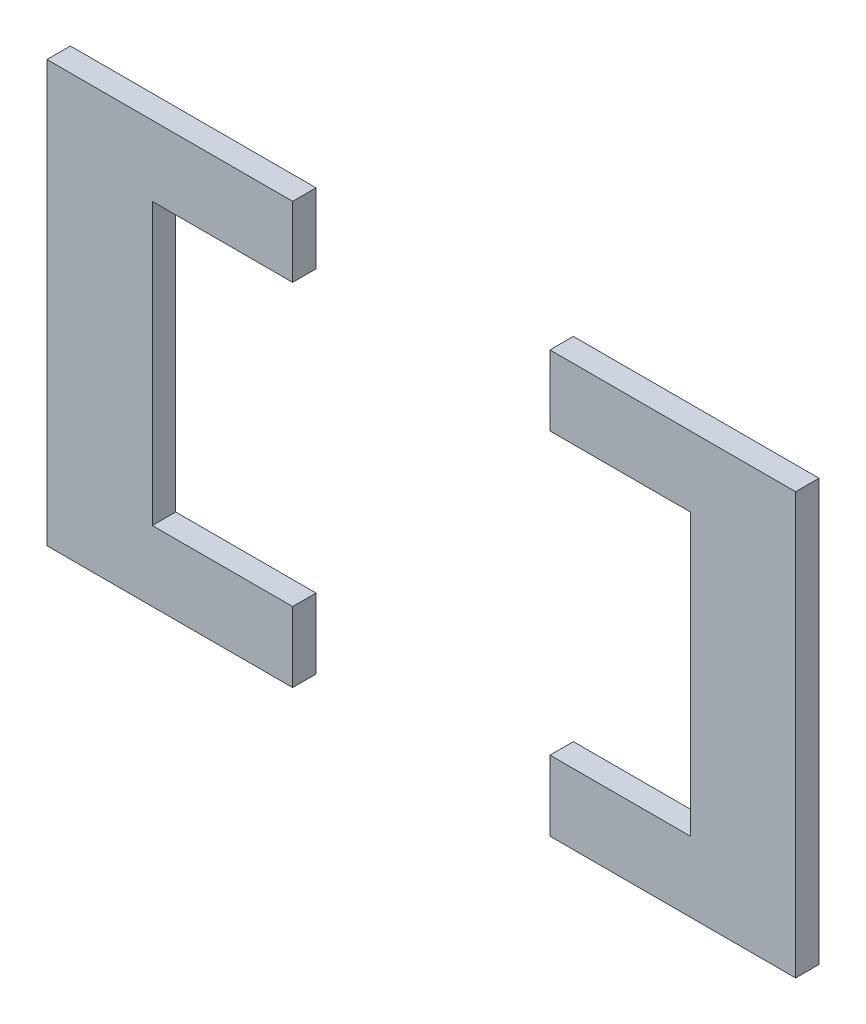
ISO-10303-21;
HEADER;
FILE_DESCRIPTION(('STEP AP214'),'2;1');
FILE_NAME('part.step','',(''),(''),'','','');
FILE_SCHEMA(('AUTOMOTIVE_DESIGN { 1 0 10303 214 1 1 1 1 }'));
ENDSEC;
DATA;
#1=APPLICATION_CONTEXT('core data for automotive mechanical design processes');
#2=APPLICATION_PROTOCOL_DEFINITION('international standard','automotive_design',2000,#1);
#3=PRODUCT_CONTEXT('',#1,'mechanical');
#4=PRODUCT('Part','Part','',(#3));
#5=PRODUCT_RELATED_PRODUCT_CATEGORY('part','',(#4));
#6=PRODUCT_DEFINITION_FORMATION('','',#4);
#7=PRODUCT_DEFINITION_CONTEXT('part definition',#1,'design');
#8=PRODUCT_DEFINITION('design','',#6,#7);
#9=PRODUCT_DEFINITION_SHAPE('','',#8);
#10=(LENGTH_UNIT() NAMED_UNIT(*) SI_UNIT(.MILLI.,.METRE.));
#11=(NAMED_UNIT(*) PLANE_ANGLE_UNIT() SI_UNIT($,.RADIAN.));
#12=(NAMED_UNIT(*) SI_UNIT($,.STERADIAN.) SOLID_ANGLE_UNIT());
#13=UNCERTAINTY_MEASURE_WITH_UNIT(LENGTH_MEASURE(1.E-05),#10,'distance_accuracy_value','');
#14=(GEOMETRIC_REPRESENTATION_CONTEXT(3) GLOBAL_UNCERTAINTY_ASSIGNED_CONTEXT((#13)) GLOBAL_UNIT_ASSIGNED_CONTEXT((#10,
#11,#12)) REPRESENTATION_CONTEXT('',''));
#15=CARTESIAN_POINT('',(0.,0.,0.));
#16=DIRECTION('',(0.,0.,1.));
#17=DIRECTION('',(1.,0.,0.));
#18=AXIS2_PLACEMENT_3D('',#15,#16,#17);
#19=CARTESIAN_POINT('',(-11.0000000000001,63.5,1.));
#20=DIRECTION('',(-1.,0.,0.));
#21=DIRECTION('',(0.,-1.,0.));
#22=AXIS2_PLACEMENT_3D('',#19,#20,#21);
#23=PLANE('',#22);
#24=DIRECTION('',(0.,1.,0.));
#25=VECTOR('',#24,1.);
#26=CARTESIAN_POINT('',(-11.0000000000001,63.5,0.));
#27=LINE('',#26,#25);
#28=CARTESIAN_POINT('',(-11.0000000000001,63.5,0.));
#29=VERTEX_POINT('',#28);
#30=CARTESIAN_POINT('',(-11.0000000000001,66.5,0.));
#31=VERTEX_POINT('',#30);
#32=EDGE_CURVE('E12',#29,#31,#27,.T.);
#33=ORIENTED_EDGE('',*,*,#32,.T.);
#34=DIRECTION('',(0.,0.,-1.));
#35=VECTOR('',#34,1.);
#36=CARTESIAN_POINT('',(-11.0000000000001,66.5,1.));
#37=LINE('',#36,#35);
#38=CARTESIAN_POINT('',(-11.0000000000001,66.5,1.));
#39=VERTEX_POINT('',#38);
#40=EDGE_CURVE('E191',#39,#31,#37,.T.);
#41=ORIENTED_EDGE('',*,*,#40,.F.);
#42=DIRECTION('',(0.,1.,0.));
#43=VECTOR('',#42,1.);
#44=CARTESIAN_POINT('',(-11.0000000000001,63.5,1.));
#45=LINE('',#44,#43);
#46=CARTESIAN_POINT('',(-11.0000000000001,63.5,1.));
#47=VERTEX_POINT('',#46);
#48=EDGE_CURVE('E59',#47,#39,#45,.T.);
#49=ORIENTED_EDGE('',*,*,#48,.F.);
#50=DIRECTION('',(0.,0.,-1.));
#51=VECTOR('',#50,1.);
#52=CARTESIAN_POINT('',(-11.0000000000001,63.5,1.));
#53=LINE('',#52,#51);
#54=EDGE_CURVE('E159',#47,#29,#53,.T.);
#55=ORIENTED_EDGE('',*,*,#54,.T.);
#56=EDGE_LOOP('',(#33,#41,#49,#55));
#57=FACE_BOUND('',#56,.T.);
#58=ADVANCED_FACE('F55',(#57),#23,.F.);
#59=CARTESIAN_POINT('',(-11.0000000000001,66.5,1.));
#60=DIRECTION('',(0.,-1.,0.));
#61=DIRECTION('',(0.,0.,-1.));
#62=AXIS2_PLACEMENT_3D('',#59,#60,#61);
#63=PLANE('',#62);
#64=DIRECTION('',(-1.,0.,0.));
#65=VECTOR('',#64,1.);
#66=CARTESIAN_POINT('',(-11.0000000000001,66.5,0.));
#67=LINE('',#66,#65);
#68=CARTESIAN_POINT('',(-21.5,66.5,0.));
#69=VERTEX_POINT('',#68);
#70=EDGE_CURVE('E65',#31,#69,#67,.T.);
#71=ORIENTED_EDGE('',*,*,#70,.T.);
#72=DIRECTION('',(0.,0.,-1.));
#73=VECTOR('',#72,1.);
#74=CARTESIAN_POINT('',(-21.5,66.5,1.));
#75=LINE('',#74,#73);
#76=CARTESIAN_POINT('',(-21.5,66.5,1.));
#77=VERTEX_POINT('',#76);
#78=EDGE_CURVE('E135',#77,#69,#75,.T.);
#79=ORIENTED_EDGE('',*,*,#78,.F.);
#80=DIRECTION('',(-1.,0.,0.));
#81=VECTOR('',#80,1.);
#82=CARTESIAN_POINT('',(-11.0000000000001,66.5,1.));
#83=LINE('',#82,#81);
#84=EDGE_CURVE('E101',#39,#77,#83,.T.);
#85=ORIENTED_EDGE('',*,*,#84,.F.);
#86=ORIENTED_EDGE('',*,*,#40,.T.);
#87=EDGE_LOOP('',(#71,#79,#85,#86));
#88=FACE_BOUND('',#87,.T.);
#89=ADVANCED_FACE('F197',(#88),#63,.F.);
#90=CARTESIAN_POINT('',(-21.5,66.5,1.));
#91=DIRECTION('',(1.,0.,0.));
#92=DIRECTION('',(0.,1.,0.));
#93=AXIS2_PLACEMENT_3D('',#90,#91,#92);
#94=PLANE('',#93);
#95=DIRECTION('',(0.,-1.,0.));
#96=VECTOR('',#95,1.);
#97=CARTESIAN_POINT('',(-21.5,66.5,0.));
#98=LINE('',#97,#96);
#99=CARTESIAN_POINT('',(-21.5,48.5,0.));
#100=VERTEX_POINT('',#99);
#101=EDGE_CURVE('E129',#69,#100,#98,.T.);
#102=ORIENTED_EDGE('',*,*,#101,.T.);
#103=DIRECTION('',(0.,0.,-1.));
#104=VECTOR('',#103,1.);
#105=CARTESIAN_POINT('',(-21.5,48.5,1.));
#106=LINE('',#105,#104);
#107=CARTESIAN_POINT('',(-21.5,48.5,1.));
#108=VERTEX_POINT('',#107);
#109=EDGE_CURVE('E133',#108,#100,#106,.T.);
#110=ORIENTED_EDGE('',*,*,#109,.F.);
#111=DIRECTION('',(0.,-1.,0.));
#112=VECTOR('',#111,1.);
#113=CARTESIAN_POINT('',(-21.5,66.5,1.));
#114=LINE('',#113,#112);
#115=EDGE_CURVE('E166',#77,#108,#114,.T.);
#116=ORIENTED_EDGE('',*,*,#115,.F.);
#117=ORIENTED_EDGE('',*,*,#78,.T.);
#118=EDGE_LOOP('',(#102,#110,#116,#117));
#119=FACE_BOUND('',#118,.T.);
#120=ADVANCED_FACE('F131',(#119),#94,.F.);
#121=CARTESIAN_POINT('',(-21.5,48.5,1.));
#122=DIRECTION('',(0.,1.,0.));
#123=DIRECTION('',(-1.,0.,0.));
#124=AXIS2_PLACEMENT_3D('',#121,#122,#123);
#125=PLANE('',#124);
#126=DIRECTION('',(1.,0.,0.));
#127=VECTOR('',#126,1.);
#128=CARTESIAN_POINT('',(-21.5,48.5,0.));
#129=LINE('',#128,#127);
#130=CARTESIAN_POINT('',(-11.0000000000001,48.5,0.));
#131=VERTEX_POINT('',#130);
#132=EDGE_CURVE('E137',#100,#131,#129,.T.);
#133=ORIENTED_EDGE('',*,*,#132,.T.);
#134=DIRECTION('',(0.,0.,-1.));
#135=VECTOR('',#134,1.);
#136=CARTESIAN_POINT('',(-11.0000000000001,48.5,1.));
#137=LINE('',#136,#135);
#138=CARTESIAN_POINT('',(-11.0000000000001,48.5,1.));
#139=VERTEX_POINT('',#138);
#140=EDGE_CURVE('E144',#139,#131,#137,.T.);
#141=ORIENTED_EDGE('',*,*,#140,.F.);
#142=DIRECTION('',(1.,0.,0.));
#143=VECTOR('',#142,1.);
#144=CARTESIAN_POINT('',(-21.5,48.5,1.));
#145=LINE('',#144,#143);
#146=EDGE_CURVE('E143',#108,#139,#145,.T.);
#147=ORIENTED_EDGE('',*,*,#146,.F.);
#148=ORIENTED_EDGE('',*,*,#109,.T.);
#149=EDGE_LOOP('',(#133,#141,#147,#148));
#150=FACE_BOUND('',#149,.T.);
#151=ADVANCED_FACE('F140',(#150),#125,.F.);
#152=CARTESIAN_POINT('',(-11.0000000000001,48.5,1.));
#153=DIRECTION('',(-1.,0.,0.));
#154=DIRECTION('',(0.,-1.,0.));
#155=AXIS2_PLACEMENT_3D('',#152,#153,#154);
#156=PLANE('',#155);
#157=DIRECTION('',(0.,1.,0.));
#158=VECTOR('',#157,1.);
#159=CARTESIAN_POINT('',(-11.0000000000001,48.5,0.));
#160=LINE('',#159,#158);
#161=CARTESIAN_POINT('',(-11.0000000000001,51.5,0.));
#162=VERTEX_POINT('',#161);
#163=EDGE_CURVE('E149',#131,#162,#160,.T.);
#164=ORIENTED_EDGE('',*,*,#163,.T.);
#165=DIRECTION('',(0.,0.,-1.));
#166=VECTOR('',#165,1.);
#167=CARTESIAN_POINT('',(-11.0000000000001,51.5,1.));
#168=LINE('',#167,#166);
#169=CARTESIAN_POINT('',(-11.0000000000001,51.5,1.));
#170=VERTEX_POINT('',#169);
#171=EDGE_CURVE('E183',#170,#162,#168,.T.);
#172=ORIENTED_EDGE('',*,*,#171,.F.);
#173=DIRECTION('',(0.,1.,0.));
#174=VECTOR('',#173,1.);
#175=CARTESIAN_POINT('',(-11.0000000000001,48.5,1.));
#176=LINE('',#175,#174);
#177=EDGE_CURVE('E163',#139,#170,#176,.T.);
#178=ORIENTED_EDGE('',*,*,#177,.F.);
#179=ORIENTED_EDGE('',*,*,#140,.T.);
#180=EDGE_LOOP('',(#164,#172,#178,#179));
#181=FACE_BOUND('',#180,.T.);
#182=ADVANCED_FACE('F200',(#181),#156,.F.);
#183=CARTESIAN_POINT('',(-11.0000000000001,51.5,1.));
#184=DIRECTION('',(0.,-1.,0.));
#185=DIRECTION('',(1.,0.,0.));
#186=AXIS2_PLACEMENT_3D('',#183,#184,#185);
#187=PLANE('',#186);
#188=DIRECTION('',(-1.,0.,0.));
#189=VECTOR('',#188,1.);
#190=CARTESIAN_POINT('',(-11.0000000000001,51.5,0.));
#191=LINE('',#190,#189);
#192=CARTESIAN_POINT('',(-17.,51.5,0.));
#193=VERTEX_POINT('',#192);
#194=EDGE_CURVE('E151',#162,#193,#191,.T.);
#195=ORIENTED_EDGE('',*,*,#194,.T.);
#196=DIRECTION('',(0.,0.,-1.));
#197=VECTOR('',#196,1.);
#198=CARTESIAN_POINT('',(-17.,51.5,1.));
#199=LINE('',#198,#197);
#200=CARTESIAN_POINT('',(-17.,51.5,1.));
#201=VERTEX_POINT('',#200);
#202=EDGE_CURVE('E180',#201,#193,#199,.T.);
#203=ORIENTED_EDGE('',*,*,#202,.F.);
#204=DIRECTION('',(-1.,0.,0.));
#205=VECTOR('',#204,1.);
#206=CARTESIAN_POINT('',(-11.0000000000001,51.5,1.));
#207=LINE('',#206,#205);
#208=EDGE_CURVE('E161',#170,#201,#207,.T.);
#209=ORIENTED_EDGE('',*,*,#208,.F.);
#210=ORIENTED_EDGE('',*,*,#171,.T.);
#211=EDGE_LOOP('',(#195,#203,#209,#210));
#212=FACE_BOUND('',#211,.T.);
#213=ADVANCED_FACE('F178',(#212),#187,.F.);
#214=CARTESIAN_POINT('',(-17.,51.5,1.));
#215=DIRECTION('',(-1.,0.,0.));
#216=DIRECTION('',(0.,0.,1.));
#217=AXIS2_PLACEMENT_3D('',#214,#215,#216);
#218=PLANE('',#217);
#219=DIRECTION('',(0.,1.,0.));
#220=VECTOR('',#219,1.);
#221=CARTESIAN_POINT('',(-17.,51.5,0.));
#222=LINE('',#221,#220);
#223=CARTESIAN_POINT('',(-17.,63.5,0.));
#224=VERTEX_POINT('',#223);
#225=EDGE_CURVE('E169',#193,#224,#222,.T.);
#226=ORIENTED_EDGE('',*,*,#225,.T.);
#227=DIRECTION('',(0.,0.,-1.));
#228=VECTOR('',#227,1.);
#229=CARTESIAN_POINT('',(-17.,63.5,1.));
#230=LINE('',#229,#228);
#231=CARTESIAN_POINT('',(-17.,63.5,1.));
#232=VERTEX_POINT('',#231);
#233=EDGE_CURVE('E188',#232,#224,#230,.T.);
#234=ORIENTED_EDGE('',*,*,#233,.F.);
#235=DIRECTION('',(0.,1.,0.));
#236=VECTOR('',#235,1.);
#237=CARTESIAN_POINT('',(-17.,51.5,1.));
#238=LINE('',#237,#236);
#239=EDGE_CURVE('E158',#201,#232,#238,.T.);
#240=ORIENTED_EDGE('',*,*,#239,.F.);
#241=ORIENTED_EDGE('',*,*,#202,.T.);
#242=EDGE_LOOP('',(#226,#234,#240,#241));
#243=FACE_BOUND('',#242,.T.);
#244=ADVANCED_FACE('F186',(#243),#218,.F.);
#245=CARTESIAN_POINT('',(-17.,63.5,1.));
#246=DIRECTION('',(0.,1.,0.));
#247=DIRECTION('',(0.,0.,1.));
#248=AXIS2_PLACEMENT_3D('',#245,#246,#247);
#249=PLANE('',#248);
#250=DIRECTION('',(1.,0.,0.));
#251=VECTOR('',#250,1.);
#252=CARTESIAN_POINT('',(-17.,63.5,0.));
#253=LINE('',#252,#251);
#254=EDGE_CURVE('E112',#224,#29,#253,.T.);
#255=ORIENTED_EDGE('',*,*,#254,.T.);
#256=ORIENTED_EDGE('',*,*,#54,.F.);
#257=DIRECTION('',(1.,0.,0.));
#258=VECTOR('',#257,1.);
#259=CARTESIAN_POINT('',(-17.,63.5,1.));
#260=LINE('',#259,#258);
#261=EDGE_CURVE('E156',#232,#47,#260,.T.);
#262=ORIENTED_EDGE('',*,*,#261,.F.);
#263=ORIENTED_EDGE('',*,*,#233,.T.);
#264=EDGE_LOOP('',(#255,#256,#262,#263));
#265=FACE_BOUND('',#264,.T.);
#266=ADVANCED_FACE('F201',(#265),#249,.F.);
#267=CARTESIAN_POINT('',(0.,0.,1.));
#268=DIRECTION('',(0.,0.,1.));
#269=DIRECTION('',(1.,0.,0.));
#270=AXIS2_PLACEMENT_3D('',#267,#268,#269);
#271=PLANE('',#270);
#272=ORIENTED_EDGE('',*,*,#48,.T.);
#273=ORIENTED_EDGE('',*,*,#84,.T.);
#274=ORIENTED_EDGE('',*,*,#115,.T.);
#275=ORIENTED_EDGE('',*,*,#146,.T.);
#276=ORIENTED_EDGE('',*,*,#177,.T.);
#277=ORIENTED_EDGE('',*,*,#208,.T.);
#278=ORIENTED_EDGE('',*,*,#239,.T.);
#279=ORIENTED_EDGE('',*,*,#261,.T.);
#280=EDGE_LOOP('',(#272,#273,#274,#275,#276,#277,#278,#279));
#281=FACE_BOUND('',#280,.T.);
#282=ADVANCED_FACE('F57',(#281),#271,.T.);
#283=CARTESIAN_POINT('',(0.,0.,0.));
#284=DIRECTION('',(0.,0.,1.));
#285=DIRECTION('',(1.,0.,0.));
#286=AXIS2_PLACEMENT_3D('',#283,#284,#285);
#287=PLANE('',#286);
#288=ORIENTED_EDGE('',*,*,#32,.F.);
#289=ORIENTED_EDGE('',*,*,#254,.F.);
#290=ORIENTED_EDGE('',*,*,#225,.F.);
#291=ORIENTED_EDGE('',*,*,#194,.F.);
#292=ORIENTED_EDGE('',*,*,#163,.F.);
#293=ORIENTED_EDGE('',*,*,#132,.F.);
#294=ORIENTED_EDGE('',*,*,#101,.F.);
#295=ORIENTED_EDGE('',*,*,#70,.F.);
#296=EDGE_LOOP('',(#288,#289,#290,#291,#292,#293,#294,#295));
#297=FACE_BOUND('',#296,.T.);
#298=ADVANCED_FACE('F147',(#297),#287,.F.);
#299=CLOSED_SHELL('',(#58,#89,#120,#151,#182,#213,#244,#266,#282,#298));
#300=MANIFOLD_SOLID_BREP('B2',#299);
#301=CARTESIAN_POINT('',(0.,63.5,1.));
#302=DIRECTION('',(1.,0.,0.));
#303=DIRECTION('',(0.,0.,-1.));
#304=AXIS2_PLACEMENT_3D('',#301,#302,#303);
#305=PLANE('',#304);
#306=DIRECTION('',(0.,-1.,0.));
#307=VECTOR('',#306,1.);
#308=CARTESIAN_POINT('',(0.,63.5,0.));
#309=LINE('',#308,#307);
#310=CARTESIAN_POINT('',(0.,66.5,0.));
#311=VERTEX_POINT('',#310);
#312=CARTESIAN_POINT('',(0.,63.5,0.));
#313=VERTEX_POINT('',#312);
#314=EDGE_CURVE('E424',#311,#313,#309,.T.);
#315=ORIENTED_EDGE('',*,*,#314,.T.);
#316=DIRECTION('',(0.,0.,-1.));
#317=VECTOR('',#316,1.);
#318=CARTESIAN_POINT('',(0.,63.5,1.));
#319=LINE('',#318,#317);
#320=CARTESIAN_POINT('',(0.,63.5,1.));
#321=VERTEX_POINT('',#320);
#322=EDGE_CURVE('E53',#321,#313,#319,.T.);
#323=ORIENTED_EDGE('',*,*,#322,.F.);
#324=DIRECTION('',(0.,-1.,0.));
#325=VECTOR('',#324,1.);
#326=CARTESIAN_POINT('',(0.,63.5,1.));
#327=LINE('',#326,#325);
#328=CARTESIAN_POINT('',(0.,66.5,1.));
#329=VERTEX_POINT('',#328);
#330=EDGE_CURVE('E446',#329,#321,#327,.T.);
#331=ORIENTED_EDGE('',*,*,#330,.F.);
#332=DIRECTION('',(0.,0.,-1.));
#333=VECTOR('',#332,1.);
#334=CARTESIAN_POINT('',(0.,66.5,1.));
#335=LINE('',#334,#333);
#336=EDGE_CURVE('E420',#329,#311,#335,.T.);
#337=ORIENTED_EDGE('',*,*,#336,.T.);
#338=EDGE_LOOP('',(#315,#323,#331,#337));
#339=FACE_BOUND('',#338,.T.);
#340=ADVANCED_FACE('F323',(#339),#305,.F.);
#341=CARTESIAN_POINT('',(5.99999999999996,63.5,1.));
#342=DIRECTION('',(0.,1.,0.));
#343=DIRECTION('',(0.,0.,1.));
#344=AXIS2_PLACEMENT_3D('',#341,#342,#343);
#345=PLANE('',#344);
#346=DIRECTION('',(1.,0.,0.));
#347=VECTOR('',#346,1.);
#348=CARTESIAN_POINT('',(5.99999999999996,63.5,0.));
#349=LINE('',#348,#347);
#350=CARTESIAN_POINT('',(5.99999999999996,63.5,0.));
#351=VERTEX_POINT('',#350);
#352=EDGE_CURVE('E428',#313,#351,#349,.T.);
#353=ORIENTED_EDGE('',*,*,#352,.T.);
#354=DIRECTION('',(0.,0.,-1.));
#355=VECTOR('',#354,1.);
#356=CARTESIAN_POINT('',(5.99999999999996,63.5,1.));
#357=LINE('',#356,#355);
#358=CARTESIAN_POINT('',(5.99999999999996,63.5,1.));
#359=VERTEX_POINT('',#358);
#360=EDGE_CURVE('E332',#359,#351,#357,.T.);
#361=ORIENTED_EDGE('',*,*,#360,.F.);
#362=DIRECTION('',(1.,0.,0.));
#363=VECTOR('',#362,1.);
#364=CARTESIAN_POINT('',(5.99999999999996,63.5,1.));
#365=LINE('',#364,#363);
#366=EDGE_CURVE('E383',#321,#359,#365,.T.);
#367=ORIENTED_EDGE('',*,*,#366,.F.);
#368=ORIENTED_EDGE('',*,*,#322,.T.);
#369=EDGE_LOOP('',(#353,#361,#367,#368));
#370=FACE_BOUND('',#369,.T.);
#371=ADVANCED_FACE('F492',(#370),#345,.F.);
#372=CARTESIAN_POINT('',(5.99999999999996,51.5,1.));
#373=DIRECTION('',(1.,0.,0.));
#374=DIRECTION('',(0.,1.,0.));
#375=AXIS2_PLACEMENT_3D('',#372,#373,#374);
#376=PLANE('',#375);
#377=DIRECTION('',(0.,-1.,0.));
#378=VECTOR('',#377,1.);
#379=CARTESIAN_POINT('',(5.99999999999996,51.5,0.));
#380=LINE('',#379,#378);
#381=CARTESIAN_POINT('',(5.99999999999996,51.5,0.));
#382=VERTEX_POINT('',#381);
#383=EDGE_CURVE('E431',#351,#382,#380,.T.);
#384=ORIENTED_EDGE('',*,*,#383,.T.);
#385=DIRECTION('',(0.,0.,-1.));
#386=VECTOR('',#385,1.);
#387=CARTESIAN_POINT('',(5.99999999999996,51.5,1.));
#388=LINE('',#387,#386);
#389=CARTESIAN_POINT('',(5.99999999999996,51.5,1.));
#390=VERTEX_POINT('',#389);
#391=EDGE_CURVE('E457',#390,#382,#388,.T.);
#392=ORIENTED_EDGE('',*,*,#391,.F.);
#393=DIRECTION('',(0.,-1.,0.));
#394=VECTOR('',#393,1.);
#395=CARTESIAN_POINT('',(5.99999999999996,51.5,1.));
#396=LINE('',#395,#394);
#397=EDGE_CURVE('E467',#359,#390,#396,.T.);
#398=ORIENTED_EDGE('',*,*,#397,.F.);
#399=ORIENTED_EDGE('',*,*,#360,.T.);
#400=EDGE_LOOP('',(#384,#392,#398,#399));
#401=FACE_BOUND('',#400,.T.);
#402=ADVANCED_FACE('F465',(#401),#376,.F.);
#403=CARTESIAN_POINT('',(0.,51.5,1.));
#404=DIRECTION('',(0.,-1.,0.));
#405=DIRECTION('',(0.,0.,-1.));
#406=AXIS2_PLACEMENT_3D('',#403,#404,#405);
#407=PLANE('',#406);
#408=DIRECTION('',(-1.,0.,0.));
#409=VECTOR('',#408,1.);
#410=CARTESIAN_POINT('',(0.,51.5,0.));
#411=LINE('',#410,#409);
#412=CARTESIAN_POINT('',(0.,51.5,0.));
#413=VERTEX_POINT('',#412);
#414=EDGE_CURVE('E434',#382,#413,#411,.T.);
#415=ORIENTED_EDGE('',*,*,#414,.T.);
#416=DIRECTION('',(0.,0.,-1.));
#417=VECTOR('',#416,1.);
#418=CARTESIAN_POINT('',(0.,51.5,1.));
#419=LINE('',#418,#417);
#420=CARTESIAN_POINT('',(0.,51.5,1.));
#421=VERTEX_POINT('',#420);
#422=EDGE_CURVE('E453',#421,#413,#419,.T.);
#423=ORIENTED_EDGE('',*,*,#422,.F.);
#424=DIRECTION('',(-1.,0.,0.));
#425=VECTOR('',#424,1.);
#426=CARTESIAN_POINT('',(0.,51.5,1.));
#427=LINE('',#426,#425);
#428=EDGE_CURVE('E480',#390,#421,#427,.T.);
#429=ORIENTED_EDGE('',*,*,#428,.F.);
#430=ORIENTED_EDGE('',*,*,#391,.T.);
#431=EDGE_LOOP('',(#415,#423,#429,#430));
#432=FACE_BOUND('',#431,.T.);
#433=ADVANCED_FACE('F475',(#432),#407,.F.);
#434=CARTESIAN_POINT('',(0.,48.5,1.));
#435=DIRECTION('',(1.,0.,0.));
#436=DIRECTION('',(0.,0.,-1.));
#437=AXIS2_PLACEMENT_3D('',#434,#435,#436);
#438=PLANE('',#437);
#439=DIRECTION('',(0.,-1.,0.));
#440=VECTOR('',#439,1.);
#441=CARTESIAN_POINT('',(0.,48.5,0.));
#442=LINE('',#441,#440);
#443=CARTESIAN_POINT('',(0.,48.5,0.));
#444=VERTEX_POINT('',#443);
#445=EDGE_CURVE('E437',#413,#444,#442,.T.);
#446=ORIENTED_EDGE('',*,*,#445,.T.);
#447=DIRECTION('',(0.,0.,-1.));
#448=VECTOR('',#447,1.);
#449=CARTESIAN_POINT('',(0.,48.5,1.));
#450=LINE('',#449,#448);
#451=CARTESIAN_POINT('',(0.,48.5,1.));
#452=VERTEX_POINT('',#451);
#453=EDGE_CURVE('E413',#452,#444,#450,.T.);
#454=ORIENTED_EDGE('',*,*,#453,.F.);
#455=DIRECTION('',(0.,-1.,0.));
#456=VECTOR('',#455,1.);
#457=CARTESIAN_POINT('',(0.,48.5,1.));
#458=LINE('',#457,#456);
#459=EDGE_CURVE('E402',#421,#452,#458,.T.);
#460=ORIENTED_EDGE('',*,*,#459,.F.);
#461=ORIENTED_EDGE('',*,*,#422,.T.);
#462=EDGE_LOOP('',(#446,#454,#460,#461));
#463=FACE_BOUND('',#462,.T.);
#464=ADVANCED_FACE('F478',(#463),#438,.F.);
#465=CARTESIAN_POINT('',(10.5,48.5,1.));
#466=DIRECTION('',(0.,1.,0.));
#467=DIRECTION('',(0.,0.,1.));
#468=AXIS2_PLACEMENT_3D('',#465,#466,#467);
#469=PLANE('',#468);
#470=DIRECTION('',(1.,0.,0.));
#471=VECTOR('',#470,1.);
#472=CARTESIAN_POINT('',(10.5,48.5,0.));
#473=LINE('',#472,#471);
#474=CARTESIAN_POINT('',(10.5,48.5,0.));
#475=VERTEX_POINT('',#474);
#476=EDGE_CURVE('E411',#444,#475,#473,.T.);
#477=ORIENTED_EDGE('',*,*,#476,.T.);
#478=DIRECTION('',(0.,0.,-1.));
#479=VECTOR('',#478,1.);
#480=CARTESIAN_POINT('',(10.5,48.5,1.));
#481=LINE('',#480,#479);
#482=CARTESIAN_POINT('',(10.5,48.5,1.));
#483=VERTEX_POINT('',#482);
#484=EDGE_CURVE('E408',#483,#475,#481,.T.);
#485=ORIENTED_EDGE('',*,*,#484,.F.);
#486=DIRECTION('',(1.,0.,0.));
#487=VECTOR('',#486,1.);
#488=CARTESIAN_POINT('',(10.5,48.5,1.));
#489=LINE('',#488,#487);
#490=EDGE_CURVE('E396',#452,#483,#489,.T.);
#491=ORIENTED_EDGE('',*,*,#490,.F.);
#492=ORIENTED_EDGE('',*,*,#453,.T.);
#493=EDGE_LOOP('',(#477,#485,#491,#492));
#494=FACE_BOUND('',#493,.T.);
#495=ADVANCED_FACE('F409',(#494),#469,.F.);
#496=CARTESIAN_POINT('',(10.5,66.5,1.));
#497=DIRECTION('',(-1.,0.,0.));
#498=DIRECTION('',(0.,-1.,0.));
#499=AXIS2_PLACEMENT_3D('',#496,#497,#498);
#500=PLANE('',#499);
#501=DIRECTION('',(0.,1.,0.));
#502=VECTOR('',#501,1.);
#503=CARTESIAN_POINT('',(10.5,66.5,0.));
#504=LINE('',#503,#502);
#505=CARTESIAN_POINT('',(10.5,66.5,0.));
#506=VERTEX_POINT('',#505);
#507=EDGE_CURVE('E369',#475,#506,#504,.T.);
#508=ORIENTED_EDGE('',*,*,#507,.T.);
#509=DIRECTION('',(0.,0.,-1.));
#510=VECTOR('',#509,1.);
#511=CARTESIAN_POINT('',(10.5,66.5,1.));
#512=LINE('',#511,#510);
#513=CARTESIAN_POINT('',(10.5,66.5,1.));
#514=VERTEX_POINT('',#513);
#515=EDGE_CURVE('E414',#514,#506,#512,.T.);
#516=ORIENTED_EDGE('',*,*,#515,.F.);
#517=DIRECTION('',(0.,1.,0.));
#518=VECTOR('',#517,1.);
#519=CARTESIAN_POINT('',(10.5,66.5,1.));
#520=LINE('',#519,#518);
#521=EDGE_CURVE('E400',#483,#514,#520,.T.);
#522=ORIENTED_EDGE('',*,*,#521,.F.);
#523=ORIENTED_EDGE('',*,*,#484,.T.);
#524=EDGE_LOOP('',(#508,#516,#522,#523));
#525=FACE_BOUND('',#524,.T.);
#526=ADVANCED_FACE('F416',(#525),#500,.F.);
#527=CARTESIAN_POINT('',(0.,66.5,1.));
#528=DIRECTION('',(0.,-1.,0.));
#529=DIRECTION('',(0.,0.,-1.));
#530=AXIS2_PLACEMENT_3D('',#527,#528,#529);
#531=PLANE('',#530);
#532=DIRECTION('',(-1.,0.,0.));
#533=VECTOR('',#532,1.);
#534=CARTESIAN_POINT('',(0.,66.5,0.));
#535=LINE('',#534,#533);
#536=EDGE_CURVE('E375',#506,#311,#535,.T.);
#537=ORIENTED_EDGE('',*,*,#536,.T.);
#538=ORIENTED_EDGE('',*,*,#336,.F.);
#539=DIRECTION('',(-1.,0.,0.));
#540=VECTOR('',#539,1.);
#541=CARTESIAN_POINT('',(0.,66.5,1.));
#542=LINE('',#541,#540);
#543=EDGE_CURVE('E340',#514,#329,#542,.T.);
#544=ORIENTED_EDGE('',*,*,#543,.F.);
#545=ORIENTED_EDGE('',*,*,#515,.T.);
#546=EDGE_LOOP('',(#537,#538,#544,#545));
#547=FACE_BOUND('',#546,.T.);
#548=ADVANCED_FACE('F508',(#547),#531,.F.);
#549=CARTESIAN_POINT('',(0.,0.,1.));
#550=DIRECTION('',(0.,0.,-1.));
#551=DIRECTION('',(-1.,0.,0.));
#552=AXIS2_PLACEMENT_3D('',#549,#550,#551);
#553=PLANE('',#552);
#554=ORIENTED_EDGE('',*,*,#330,.T.);
#555=ORIENTED_EDGE('',*,*,#366,.T.);
#556=ORIENTED_EDGE('',*,*,#397,.T.);
#557=ORIENTED_EDGE('',*,*,#428,.T.);
#558=ORIENTED_EDGE('',*,*,#459,.T.);
#559=ORIENTED_EDGE('',*,*,#490,.T.);
#560=ORIENTED_EDGE('',*,*,#521,.T.);
#561=ORIENTED_EDGE('',*,*,#543,.T.);
#562=EDGE_LOOP('',(#554,#555,#556,#557,#558,#559,#560,#561));
#563=FACE_BOUND('',#562,.T.);
#564=ADVANCED_FACE('F398',(#563),#553,.F.);
#565=CARTESIAN_POINT('',(0.,0.,0.));
#566=DIRECTION('',(0.,0.,-1.));
#567=DIRECTION('',(-1.,0.,0.));
#568=AXIS2_PLACEMENT_3D('',#565,#566,#567);
#569=PLANE('',#568);
#570=ORIENTED_EDGE('',*,*,#314,.F.);
#571=ORIENTED_EDGE('',*,*,#536,.F.);
#572=ORIENTED_EDGE('',*,*,#507,.F.);
#573=ORIENTED_EDGE('',*,*,#476,.F.);
#574=ORIENTED_EDGE('',*,*,#445,.F.);
#575=ORIENTED_EDGE('',*,*,#414,.F.);
#576=ORIENTED_EDGE('',*,*,#383,.F.);
#577=ORIENTED_EDGE('',*,*,#352,.F.);
#578=EDGE_LOOP('',(#570,#571,#572,#573,#574,#575,#576,#577));
#579=FACE_BOUND('',#578,.T.);
#580=ADVANCED_FACE('F471',(#579),#569,.T.);
#581=CLOSED_SHELL('',(#340,#371,#402,#433,#464,#495,#526,#548,#564,#580));
#582=MANIFOLD_SOLID_BREP('B6',#581);
#583=ADVANCED_BREP_SHAPE_REPRESENTATION('',(#18,#300,#582),#14);
#584=SHAPE_DEFINITION_REPRESENTATION(#9,#583);
ENDSEC;
END-ISO-10303-21;
